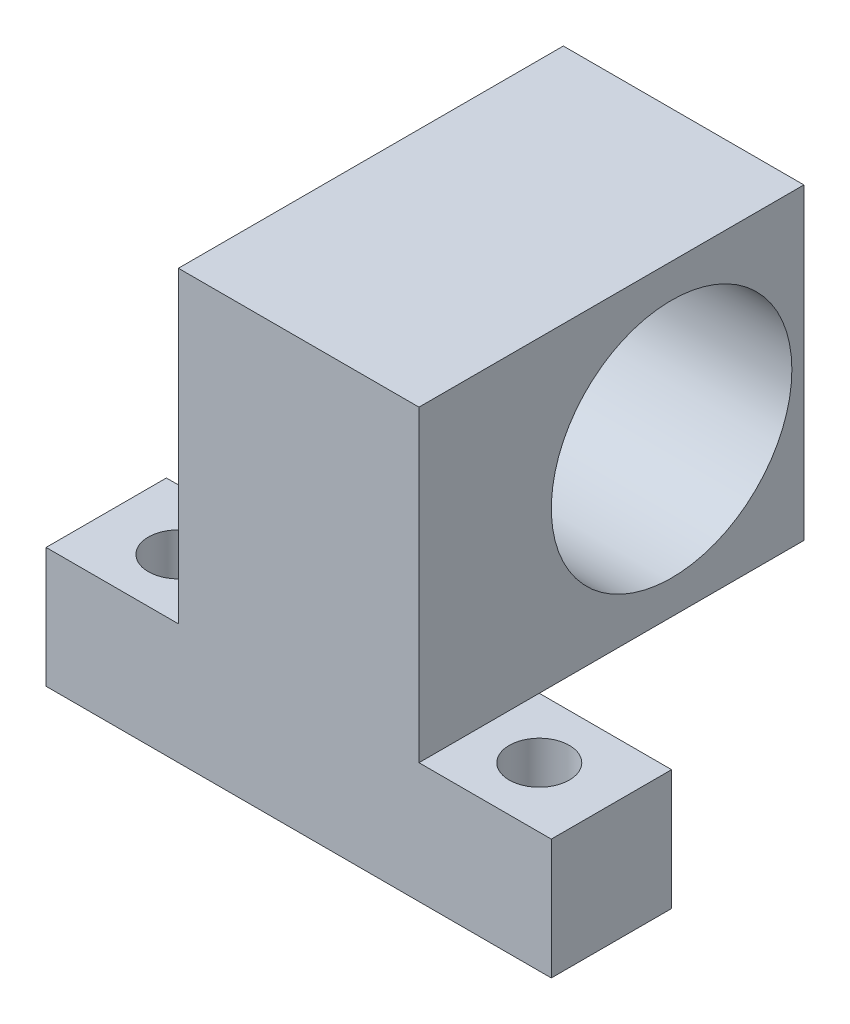
ISO-10303-21;
HEADER;
FILE_DESCRIPTION(('STEP AP214'),'2;1');
FILE_NAME('part.step','',(''),(''),'','','');
FILE_SCHEMA(('AUTOMOTIVE_DESIGN { 1 0 10303 214 1 1 1 1 }'));
ENDSEC;
DATA;
#1=APPLICATION_CONTEXT('core data for automotive mechanical design processes');
#2=APPLICATION_PROTOCOL_DEFINITION('international standard','automotive_design',2000,#1);
#3=PRODUCT_CONTEXT('',#1,'mechanical');
#4=PRODUCT('Part','Part','',(#3));
#5=PRODUCT_RELATED_PRODUCT_CATEGORY('part','',(#4));
#6=PRODUCT_DEFINITION_FORMATION('','',#4);
#7=PRODUCT_DEFINITION_CONTEXT('part definition',#1,'design');
#8=PRODUCT_DEFINITION('design','',#6,#7);
#9=PRODUCT_DEFINITION_SHAPE('','',#8);
#10=(LENGTH_UNIT() NAMED_UNIT(*) SI_UNIT(.MILLI.,.METRE.));
#11=(NAMED_UNIT(*) PLANE_ANGLE_UNIT() SI_UNIT($,.RADIAN.));
#12=(NAMED_UNIT(*) SI_UNIT($,.STERADIAN.) SOLID_ANGLE_UNIT());
#13=UNCERTAINTY_MEASURE_WITH_UNIT(LENGTH_MEASURE(1.E-05),#10,'distance_accuracy_value','');
#14=(GEOMETRIC_REPRESENTATION_CONTEXT(3) GLOBAL_UNCERTAINTY_ASSIGNED_CONTEXT((#13)) GLOBAL_UNIT_ASSIGNED_CONTEXT((#10,
#11,#12)) REPRESENTATION_CONTEXT('',''));
#15=CARTESIAN_POINT('',(0.,0.,0.));
#16=DIRECTION('',(0.,0.,1.));
#17=DIRECTION('',(1.,0.,0.));
#18=AXIS2_PLACEMENT_3D('',#15,#16,#17);
#19=CARTESIAN_POINT('',(0.,5.,5.));
#20=DIRECTION('',(0.,-1.,0.));
#21=DIRECTION('',(0.,0.,-1.));
#22=AXIS2_PLACEMENT_3D('',#19,#20,#21);
#23=PLANE('',#22);
#24=CARTESIAN_POINT('',(3.,5.,2.5));
#25=DIRECTION('',(0.,1.,0.));
#26=DIRECTION('',(0.,0.,1.));
#27=AXIS2_PLACEMENT_3D('',#24,#25,#26);
#28=CIRCLE('',#27,1.25);
#29=CARTESIAN_POINT('',(3.,5.,3.75));
#30=VERTEX_POINT('',#29);
#31=EDGE_CURVE('E171',#30,#30,#28,.T.);
#32=ORIENTED_EDGE('',*,*,#31,.F.);
#33=EDGE_LOOP('',(#32));
#34=FACE_BOUND('',#33,.T.);
#35=DIRECTION('',(0.,0.,1.));
#36=VECTOR('',#35,1.);
#37=CARTESIAN_POINT('',(5.5,5.,5.));
#38=LINE('',#37,#36);
#39=CARTESIAN_POINT('',(5.49999999999999,5.,0.));
#40=VERTEX_POINT('',#39);
#41=CARTESIAN_POINT('',(5.49999999999999,5.,5.));
#42=VERTEX_POINT('',#41);
#43=EDGE_CURVE('E11',#40,#42,#38,.T.);
#44=ORIENTED_EDGE('',*,*,#43,.F.);
#45=DIRECTION('',(-1.,0.,0.));
#46=VECTOR('',#45,1.);
#47=CARTESIAN_POINT('',(0.,5.,0.));
#48=LINE('',#47,#46);
#49=CARTESIAN_POINT('',(0.,5.,0.));
#50=VERTEX_POINT('',#49);
#51=EDGE_CURVE('E157',#40,#50,#48,.T.);
#52=ORIENTED_EDGE('',*,*,#51,.T.);
#53=DIRECTION('',(0.,0.,-1.));
#54=VECTOR('',#53,1.);
#55=CARTESIAN_POINT('',(0.,5.,5.));
#56=LINE('',#55,#54);
#57=CARTESIAN_POINT('',(0.,5.,5.));
#58=VERTEX_POINT('',#57);
#59=EDGE_CURVE('E152',#58,#50,#56,.T.);
#60=ORIENTED_EDGE('',*,*,#59,.F.);
#61=DIRECTION('',(-1.,0.,0.));
#62=VECTOR('',#61,1.);
#63=CARTESIAN_POINT('',(0.,5.,5.));
#64=LINE('',#63,#62);
#65=EDGE_CURVE('E55',#42,#58,#64,.T.);
#66=ORIENTED_EDGE('',*,*,#65,.F.);
#67=EDGE_LOOP('',(#44,#52,#60,#66));
#68=FACE_BOUND('',#67,.T.);
#69=ADVANCED_FACE('F37',(#34,#68),#23,.F.);
#70=CARTESIAN_POINT('',(18.,5.,2.5));
#71=DIRECTION('',(0.,1.,0.));
#72=DIRECTION('',(0.,0.,-1.));
#73=AXIS2_PLACEMENT_3D('',#70,#71,#72);
#74=CIRCLE('',#73,1.25);
#75=CARTESIAN_POINT('',(18.,5.,3.75));
#76=VERTEX_POINT('',#75);
#77=EDGE_CURVE('E176',#76,#76,#74,.T.);
#78=ORIENTED_EDGE('',*,*,#77,.F.);
#79=EDGE_LOOP('',(#78));
#80=FACE_BOUND('',#79,.T.);
#81=DIRECTION('',(0.,0.,-1.));
#82=VECTOR('',#81,1.);
#83=CARTESIAN_POINT('',(15.5,5.,5.));
#84=LINE('',#83,#82);
#85=CARTESIAN_POINT('',(15.5,5.,5.));
#86=VERTEX_POINT('',#85);
#87=CARTESIAN_POINT('',(15.5,5.,0.));
#88=VERTEX_POINT('',#87);
#89=EDGE_CURVE('E62',#86,#88,#84,.T.);
#90=ORIENTED_EDGE('',*,*,#89,.F.);
#91=CARTESIAN_POINT('',(21.,5.,5.));
#92=VERTEX_POINT('',#91);
#93=EDGE_CURVE('E151',#92,#86,#64,.T.);
#94=ORIENTED_EDGE('',*,*,#93,.F.);
#95=DIRECTION('',(0.,0.,-1.));
#96=VECTOR('',#95,1.);
#97=CARTESIAN_POINT('',(21.,5.,5.));
#98=LINE('',#97,#96);
#99=CARTESIAN_POINT('',(21.,5.,0.));
#100=VERTEX_POINT('',#99);
#101=EDGE_CURVE('E162',#92,#100,#98,.T.);
#102=ORIENTED_EDGE('',*,*,#101,.T.);
#103=EDGE_CURVE('E147',#100,#88,#48,.T.);
#104=ORIENTED_EDGE('',*,*,#103,.T.);
#105=EDGE_LOOP('',(#90,#94,#102,#104));
#106=FACE_BOUND('',#105,.T.);
#107=ADVANCED_FACE('F220',(#80,#106),#23,.F.);
#108=CARTESIAN_POINT('',(0.,0.,5.));
#109=DIRECTION('',(1.,0.,0.));
#110=DIRECTION('',(0.,0.,-1.));
#111=AXIS2_PLACEMENT_3D('',#108,#109,#110);
#112=PLANE('',#111);
#113=DIRECTION('',(0.,-1.,0.));
#114=VECTOR('',#113,1.);
#115=CARTESIAN_POINT('',(0.,0.,0.));
#116=LINE('',#115,#114);
#117=CARTESIAN_POINT('',(0.,0.,0.));
#118=VERTEX_POINT('',#117);
#119=EDGE_CURVE('E135',#50,#118,#116,.T.);
#120=ORIENTED_EDGE('',*,*,#119,.T.);
#121=DIRECTION('',(0.,0.,-1.));
#122=VECTOR('',#121,1.);
#123=CARTESIAN_POINT('',(0.,0.,5.));
#124=LINE('',#123,#122);
#125=CARTESIAN_POINT('',(0.,0.,5.));
#126=VERTEX_POINT('',#125);
#127=EDGE_CURVE('E46',#126,#118,#124,.T.);
#128=ORIENTED_EDGE('',*,*,#127,.F.);
#129=DIRECTION('',(0.,-1.,0.));
#130=VECTOR('',#129,1.);
#131=CARTESIAN_POINT('',(0.,0.,5.));
#132=LINE('',#131,#130);
#133=EDGE_CURVE('E144',#58,#126,#132,.T.);
#134=ORIENTED_EDGE('',*,*,#133,.F.);
#135=ORIENTED_EDGE('',*,*,#59,.T.);
#136=EDGE_LOOP('',(#120,#128,#134,#135));
#137=FACE_BOUND('',#136,.T.);
#138=ADVANCED_FACE('F39',(#137),#112,.F.);
#139=CARTESIAN_POINT('',(0.,0.,5.));
#140=DIRECTION('',(0.,1.,0.));
#141=DIRECTION('',(0.,0.,1.));
#142=AXIS2_PLACEMENT_3D('',#139,#140,#141);
#143=PLANE('',#142);
#144=CARTESIAN_POINT('',(3.,0.,2.5));
#145=DIRECTION('',(0.,1.,0.));
#146=DIRECTION('',(0.,0.,1.));
#147=AXIS2_PLACEMENT_3D('',#144,#145,#146);
#148=CIRCLE('',#147,1.25);
#149=CARTESIAN_POINT('',(3.,0.,3.75));
#150=VERTEX_POINT('',#149);
#151=EDGE_CURVE('E41',#150,#150,#148,.T.);
#152=ORIENTED_EDGE('',*,*,#151,.T.);
#153=EDGE_LOOP('',(#152));
#154=FACE_BOUND('',#153,.T.);
#155=CARTESIAN_POINT('',(18.,0.,2.5));
#156=DIRECTION('',(0.,1.,0.));
#157=DIRECTION('',(0.,0.,1.));
#158=AXIS2_PLACEMENT_3D('',#155,#156,#157);
#159=CIRCLE('',#158,1.25);
#160=CARTESIAN_POINT('',(18.,0.,3.75));
#161=VERTEX_POINT('',#160);
#162=EDGE_CURVE('E169',#161,#161,#159,.T.);
#163=ORIENTED_EDGE('',*,*,#162,.T.);
#164=EDGE_LOOP('',(#163));
#165=FACE_BOUND('',#164,.T.);
#166=DIRECTION('',(1.,0.,0.));
#167=VECTOR('',#166,1.);
#168=CARTESIAN_POINT('',(0.,0.,0.));
#169=LINE('',#168,#167);
#170=CARTESIAN_POINT('',(21.,0.,0.));
#171=VERTEX_POINT('',#170);
#172=EDGE_CURVE('E138',#118,#171,#169,.T.);
#173=ORIENTED_EDGE('',*,*,#172,.T.);
#174=DIRECTION('',(0.,0.,-1.));
#175=VECTOR('',#174,1.);
#176=CARTESIAN_POINT('',(21.,0.,5.));
#177=LINE('',#176,#175);
#178=CARTESIAN_POINT('',(21.,0.,5.));
#179=VERTEX_POINT('',#178);
#180=EDGE_CURVE('E165',#179,#171,#177,.T.);
#181=ORIENTED_EDGE('',*,*,#180,.F.);
#182=DIRECTION('',(1.,0.,0.));
#183=VECTOR('',#182,1.);
#184=CARTESIAN_POINT('',(0.,0.,5.));
#185=LINE('',#184,#183);
#186=EDGE_CURVE('E146',#126,#179,#185,.T.);
#187=ORIENTED_EDGE('',*,*,#186,.F.);
#188=ORIENTED_EDGE('',*,*,#127,.T.);
#189=EDGE_LOOP('',(#173,#181,#187,#188));
#190=FACE_BOUND('',#189,.T.);
#191=ADVANCED_FACE('F215',(#154,#165,#190),#143,.F.);
#192=CARTESIAN_POINT('',(21.,0.,5.));
#193=DIRECTION('',(-1.,0.,0.));
#194=DIRECTION('',(0.,0.,1.));
#195=AXIS2_PLACEMENT_3D('',#192,#193,#194);
#196=PLANE('',#195);
#197=DIRECTION('',(0.,1.,0.));
#198=VECTOR('',#197,1.);
#199=CARTESIAN_POINT('',(21.,0.,0.));
#200=LINE('',#199,#198);
#201=EDGE_CURVE('E155',#171,#100,#200,.T.);
#202=ORIENTED_EDGE('',*,*,#201,.T.);
#203=ORIENTED_EDGE('',*,*,#101,.F.);
#204=DIRECTION('',(0.,1.,0.));
#205=VECTOR('',#204,1.);
#206=CARTESIAN_POINT('',(21.,0.,5.));
#207=LINE('',#206,#205);
#208=EDGE_CURVE('E149',#179,#92,#207,.T.);
#209=ORIENTED_EDGE('',*,*,#208,.F.);
#210=ORIENTED_EDGE('',*,*,#180,.T.);
#211=EDGE_LOOP('',(#202,#203,#209,#210));
#212=FACE_BOUND('',#211,.T.);
#213=ADVANCED_FACE('F219',(#212),#196,.F.);
#214=CARTESIAN_POINT('',(0.,0.,5.));
#215=DIRECTION('',(0.,0.,-1.));
#216=DIRECTION('',(-1.,0.,0.));
#217=AXIS2_PLACEMENT_3D('',#214,#215,#216);
#218=PLANE('',#217);
#219=ORIENTED_EDGE('',*,*,#133,.T.);
#220=ORIENTED_EDGE('',*,*,#186,.T.);
#221=ORIENTED_EDGE('',*,*,#208,.T.);
#222=ORIENTED_EDGE('',*,*,#93,.T.);
#223=DIRECTION('',(0.,-1.,0.));
#224=VECTOR('',#223,1.);
#225=CARTESIAN_POINT('',(15.5,17.8,5.));
#226=LINE('',#225,#224);
#227=CARTESIAN_POINT('',(15.5,17.8,5.));
#228=VERTEX_POINT('',#227);
#229=EDGE_CURVE('E118',#228,#86,#226,.T.);
#230=ORIENTED_EDGE('',*,*,#229,.F.);
#231=DIRECTION('',(1.,0.,0.));
#232=VECTOR('',#231,1.);
#233=CARTESIAN_POINT('',(5.5,17.8,5.));
#234=LINE('',#233,#232);
#235=CARTESIAN_POINT('',(5.5,17.8,5.));
#236=VERTEX_POINT('',#235);
#237=EDGE_CURVE('E111',#236,#228,#234,.T.);
#238=ORIENTED_EDGE('',*,*,#237,.F.);
#239=DIRECTION('',(0.,-1.,0.));
#240=VECTOR('',#239,1.);
#241=CARTESIAN_POINT('',(5.5,17.8,5.));
#242=LINE('',#241,#240);
#243=EDGE_CURVE('E116',#236,#42,#242,.T.);
#244=ORIENTED_EDGE('',*,*,#243,.T.);
#245=ORIENTED_EDGE('',*,*,#65,.T.);
#246=EDGE_LOOP('',(#219,#220,#221,#222,#230,#238,#244,#245));
#247=FACE_BOUND('',#246,.T.);
#248=ADVANCED_FACE('F114',(#247),#218,.F.);
#249=CARTESIAN_POINT('',(0.,0.,0.));
#250=DIRECTION('',(0.,0.,-1.));
#251=DIRECTION('',(-1.,0.,0.));
#252=AXIS2_PLACEMENT_3D('',#249,#250,#251);
#253=PLANE('',#252);
#254=ORIENTED_EDGE('',*,*,#119,.F.);
#255=ORIENTED_EDGE('',*,*,#51,.F.);
#256=EDGE_CURVE('E159',#88,#40,#48,.T.);
#257=ORIENTED_EDGE('',*,*,#256,.F.);
#258=ORIENTED_EDGE('',*,*,#103,.F.);
#259=ORIENTED_EDGE('',*,*,#201,.F.);
#260=ORIENTED_EDGE('',*,*,#172,.F.);
#261=EDGE_LOOP('',(#254,#255,#257,#258,#259,#260));
#262=FACE_BOUND('',#261,.T.);
#263=ADVANCED_FACE('F211',(#262),#253,.T.);
#264=CARTESIAN_POINT('',(5.5,17.8,5.));
#265=DIRECTION('',(1.,0.,0.));
#266=DIRECTION('',(0.,0.,-1.));
#267=AXIS2_PLACEMENT_3D('',#264,#265,#266);
#268=PLANE('',#267);
#269=CARTESIAN_POINT('',(5.5,11.4,-5.5));
#270=DIRECTION('',(1.,0.,0.));
#271=DIRECTION('',(0.,0.,-1.));
#272=AXIS2_PLACEMENT_3D('',#269,#270,#271);
#273=CIRCLE('',#272,5.);
#274=CARTESIAN_POINT('',(5.5,11.4,-10.5));
#275=VERTEX_POINT('',#274);
#276=EDGE_CURVE('E181',#275,#275,#273,.T.);
#277=ORIENTED_EDGE('',*,*,#276,.T.);
#278=EDGE_LOOP('',(#277));
#279=FACE_BOUND('',#278,.T.);
#280=CARTESIAN_POINT('',(5.5,5.,-11.));
#281=VERTEX_POINT('',#280);
#282=EDGE_CURVE('E48',#281,#40,#38,.T.);
#283=ORIENTED_EDGE('',*,*,#282,.T.);
#284=ORIENTED_EDGE('',*,*,#43,.T.);
#285=ORIENTED_EDGE('',*,*,#243,.F.);
#286=DIRECTION('',(0.,0.,1.));
#287=VECTOR('',#286,1.);
#288=CARTESIAN_POINT('',(5.5,17.8,5.));
#289=LINE('',#288,#287);
#290=CARTESIAN_POINT('',(5.5,17.8,-11.));
#291=VERTEX_POINT('',#290);
#292=EDGE_CURVE('E122',#291,#236,#289,.T.);
#293=ORIENTED_EDGE('',*,*,#292,.F.);
#294=DIRECTION('',(0.,-1.,0.));
#295=VECTOR('',#294,1.);
#296=CARTESIAN_POINT('',(5.5,17.8,-11.));
#297=LINE('',#296,#295);
#298=EDGE_CURVE('E187',#291,#281,#297,.T.);
#299=ORIENTED_EDGE('',*,*,#298,.T.);
#300=EDGE_LOOP('',(#283,#284,#285,#293,#299));
#301=FACE_BOUND('',#300,.T.);
#302=ADVANCED_FACE('F134',(#279,#301),#268,.F.);
#303=CARTESIAN_POINT('',(15.5,17.8,5.));
#304=DIRECTION('',(-1.,0.,0.));
#305=DIRECTION('',(0.,0.,1.));
#306=AXIS2_PLACEMENT_3D('',#303,#304,#305);
#307=PLANE('',#306);
#308=CARTESIAN_POINT('',(15.5,11.4,-5.5));
#309=DIRECTION('',(1.,0.,0.));
#310=DIRECTION('',(0.,0.,-1.));
#311=AXIS2_PLACEMENT_3D('',#308,#309,#310);
#312=CIRCLE('',#311,5.);
#313=CARTESIAN_POINT('',(15.5,11.4,-10.5));
#314=VERTEX_POINT('',#313);
#315=EDGE_CURVE('E358',#314,#314,#312,.T.);
#316=ORIENTED_EDGE('',*,*,#315,.F.);
#317=EDGE_LOOP('',(#316));
#318=FACE_BOUND('',#317,.T.);
#319=ORIENTED_EDGE('',*,*,#89,.T.);
#320=CARTESIAN_POINT('',(15.5,5.,-11.));
#321=VERTEX_POINT('',#320);
#322=EDGE_CURVE('E189',#88,#321,#84,.T.);
#323=ORIENTED_EDGE('',*,*,#322,.T.);
#324=DIRECTION('',(0.,-1.,0.));
#325=VECTOR('',#324,1.);
#326=CARTESIAN_POINT('',(15.5,17.8,-11.));
#327=LINE('',#326,#325);
#328=CARTESIAN_POINT('',(15.5,17.8,-11.));
#329=VERTEX_POINT('',#328);
#330=EDGE_CURVE('E140',#329,#321,#327,.T.);
#331=ORIENTED_EDGE('',*,*,#330,.F.);
#332=DIRECTION('',(0.,0.,-1.));
#333=VECTOR('',#332,1.);
#334=CARTESIAN_POINT('',(15.5,17.8,5.));
#335=LINE('',#334,#333);
#336=EDGE_CURVE('E121',#228,#329,#335,.T.);
#337=ORIENTED_EDGE('',*,*,#336,.F.);
#338=ORIENTED_EDGE('',*,*,#229,.T.);
#339=EDGE_LOOP('',(#319,#323,#331,#337,#338));
#340=FACE_BOUND('',#339,.T.);
#341=ADVANCED_FACE('F260',(#318,#340),#307,.F.);
#342=CARTESIAN_POINT('',(5.5,17.8,-11.));
#343=DIRECTION('',(0.,0.,1.));
#344=DIRECTION('',(1.,0.,0.));
#345=AXIS2_PLACEMENT_3D('',#342,#343,#344);
#346=PLANE('',#345);
#347=DIRECTION('',(-1.,0.,0.));
#348=VECTOR('',#347,1.);
#349=CARTESIAN_POINT('',(5.5,5.,-11.));
#350=LINE('',#349,#348);
#351=EDGE_CURVE('E131',#321,#281,#350,.T.);
#352=ORIENTED_EDGE('',*,*,#351,.T.);
#353=ORIENTED_EDGE('',*,*,#298,.F.);
#354=DIRECTION('',(-1.,0.,0.));
#355=VECTOR('',#354,1.);
#356=CARTESIAN_POINT('',(5.5,17.8,-11.));
#357=LINE('',#356,#355);
#358=EDGE_CURVE('E127',#329,#291,#357,.T.);
#359=ORIENTED_EDGE('',*,*,#358,.F.);
#360=ORIENTED_EDGE('',*,*,#330,.T.);
#361=EDGE_LOOP('',(#352,#353,#359,#360));
#362=FACE_BOUND('',#361,.T.);
#363=ADVANCED_FACE('F196',(#362),#346,.F.);
#364=CARTESIAN_POINT('',(0.,17.8,0.));
#365=DIRECTION('',(0.,-1.,0.));
#366=DIRECTION('',(0.,0.,-1.));
#367=AXIS2_PLACEMENT_3D('',#364,#365,#366);
#368=PLANE('',#367);
#369=ORIENTED_EDGE('',*,*,#292,.T.);
#370=ORIENTED_EDGE('',*,*,#237,.T.);
#371=ORIENTED_EDGE('',*,*,#336,.T.);
#372=ORIENTED_EDGE('',*,*,#358,.T.);
#373=EDGE_LOOP('',(#369,#370,#371,#372));
#374=FACE_BOUND('',#373,.T.);
#375=ADVANCED_FACE('F125',(#374),#368,.F.);
#376=CARTESIAN_POINT('',(0.,5.,0.));
#377=DIRECTION('',(0.,-1.,0.));
#378=DIRECTION('',(0.,0.,-1.));
#379=AXIS2_PLACEMENT_3D('',#376,#377,#378);
#380=PLANE('',#379);
#381=ORIENTED_EDGE('',*,*,#322,.F.);
#382=ORIENTED_EDGE('',*,*,#256,.T.);
#383=ORIENTED_EDGE('',*,*,#282,.F.);
#384=ORIENTED_EDGE('',*,*,#351,.F.);
#385=EDGE_LOOP('',(#381,#382,#383,#384));
#386=FACE_BOUND('',#385,.T.);
#387=ADVANCED_FACE('F201',(#386),#380,.T.);
#388=CARTESIAN_POINT('',(18.,-8.,2.5));
#389=DIRECTION('',(0.,1.,0.));
#390=DIRECTION('',(0.,0.,1.));
#391=AXIS2_PLACEMENT_3D('',#388,#389,#390);
#392=CYLINDRICAL_SURFACE('',#391,1.25);
#393=CARTESIAN_POINT('',(18.,5.,3.75));
#394=CARTESIAN_POINT('',(18.,4.94791666666667,3.75));
#395=CARTESIAN_POINT('',(18.,4.89583333333333,3.75));
#396=CARTESIAN_POINT('',(18.,4.79166666666667,3.75));
#397=CARTESIAN_POINT('',(18.,4.73958333333333,3.75));
#398=CARTESIAN_POINT('',(18.,4.63541666666667,3.75));
#399=CARTESIAN_POINT('',(18.,4.58333333333333,3.75));
#400=CARTESIAN_POINT('',(18.,4.47916666666667,3.75));
#401=CARTESIAN_POINT('',(18.,4.42708333333333,3.75));
#402=CARTESIAN_POINT('',(18.,4.32291666666667,3.75));
#403=CARTESIAN_POINT('',(18.,4.27083333333333,3.75));
#404=CARTESIAN_POINT('',(18.,4.16666666666667,3.75));
#405=CARTESIAN_POINT('',(18.,4.11458333333333,3.75));
#406=CARTESIAN_POINT('',(18.,4.01041666666666,3.75));
#407=CARTESIAN_POINT('',(18.,3.95833333333333,3.75));
#408=CARTESIAN_POINT('',(18.,3.85416666666667,3.75));
#409=CARTESIAN_POINT('',(18.,3.80208333333333,3.75));
#410=CARTESIAN_POINT('',(18.,3.69791666666666,3.75));
#411=CARTESIAN_POINT('',(18.,3.64583333333333,3.75));
#412=CARTESIAN_POINT('',(18.,3.54166666666667,3.75));
#413=CARTESIAN_POINT('',(18.,3.48958333333333,3.75));
#414=CARTESIAN_POINT('',(18.,3.38541666666667,3.75));
#415=CARTESIAN_POINT('',(18.,3.33333333333333,3.75));
#416=CARTESIAN_POINT('',(18.,3.22916666666667,3.75));
#417=CARTESIAN_POINT('',(18.,3.17708333333333,3.75));
#418=CARTESIAN_POINT('',(18.,3.07291666666667,3.75));
#419=CARTESIAN_POINT('',(18.,3.02083333333333,3.75));
#420=CARTESIAN_POINT('',(18.,2.91666666666667,3.75));
#421=CARTESIAN_POINT('',(18.,2.86458333333333,3.75));
#422=CARTESIAN_POINT('',(18.,2.76041666666667,3.75));
#423=CARTESIAN_POINT('',(18.,2.70833333333333,3.75));
#424=CARTESIAN_POINT('',(18.,2.60416666666667,3.75));
#425=CARTESIAN_POINT('',(18.,2.55208333333333,3.75));
#426=CARTESIAN_POINT('',(18.,2.44791666666667,3.75));
#427=CARTESIAN_POINT('',(18.,2.39583333333333,3.75));
#428=CARTESIAN_POINT('',(18.,2.29166666666667,3.75));
#429=CARTESIAN_POINT('',(18.,2.23958333333333,3.75));
#430=CARTESIAN_POINT('',(18.,2.13541666666667,3.75));
#431=CARTESIAN_POINT('',(18.,2.08333333333333,3.75));
#432=CARTESIAN_POINT('',(18.,1.97916666666667,3.75));
#433=CARTESIAN_POINT('',(18.,1.92708333333333,3.75));
#434=CARTESIAN_POINT('',(18.,1.82291666666666,3.75));
#435=CARTESIAN_POINT('',(18.,1.77083333333333,3.75));
#436=CARTESIAN_POINT('',(18.,1.66666666666667,3.75));
#437=CARTESIAN_POINT('',(18.,1.61458333333333,3.75));
#438=CARTESIAN_POINT('',(18.,1.51041666666667,3.75));
#439=CARTESIAN_POINT('',(18.,1.45833333333333,3.75));
#440=CARTESIAN_POINT('',(18.,1.35416666666667,3.75));
#441=CARTESIAN_POINT('',(18.,1.30208333333333,3.75));
#442=CARTESIAN_POINT('',(18.,1.19791666666667,3.75));
#443=CARTESIAN_POINT('',(18.,1.14583333333333,3.75));
#444=CARTESIAN_POINT('',(18.,1.04166666666667,3.75));
#445=CARTESIAN_POINT('',(18.,0.989583333333333,3.75));
#446=CARTESIAN_POINT('',(18.,0.885416666666666,3.75));
#447=CARTESIAN_POINT('',(18.,0.833333333333332,3.75));
#448=CARTESIAN_POINT('',(18.,0.729166666666666,3.75));
#449=CARTESIAN_POINT('',(18.,0.677083333333332,3.75));
#450=CARTESIAN_POINT('',(18.,0.572916666666666,3.75));
#451=CARTESIAN_POINT('',(18.,0.520833333333332,3.75));
#452=CARTESIAN_POINT('',(18.,0.416666666666665,3.75));
#453=CARTESIAN_POINT('',(18.,0.364583333333332,3.75));
#454=CARTESIAN_POINT('',(18.,0.260416666666665,3.75));
#455=CARTESIAN_POINT('',(18.,0.208333333333332,3.75));
#456=CARTESIAN_POINT('',(18.,0.104166666666665,3.75));
#457=CARTESIAN_POINT('',(18.,0.0520833333333317,3.75));
#458=CARTESIAN_POINT('',(18.,0.,3.75));
#459=B_SPLINE_CURVE_WITH_KNOTS('',3,(#393,#394,#395,#396,#397,#398,#399,#400,#401,#402,#403,
#404,#405,#406,#407,#408,#409,#410,#411,#412,#413,#414,#415,#416,#417,#418,#419,#420,#421,#422,
#423,#424,#425,#426,#427,#428,#429,#430,#431,#432,#433,#434,#435,#436,#437,#438,#439,#440,#441,
#442,#443,#444,#445,#446,#447,#448,#449,#450,#451,#452,#453,#454,#455,#456,#457,#458),
.UNSPECIFIED.,.F.,.F.,(4,2,2,2,2,2,2,2,2,2,2,2,2,2,2,2,2,2,2,2,2,2,2,2,2,2,2,2,2,2,2,2,4),(0.,
0.15625,0.3125,0.46875,0.625000000000001,0.781250000000001,0.937500000000001,1.09375,1.25,
1.40625,1.5625,1.71875,1.875,2.03125,2.1875,2.34375,2.5,2.65625,2.8125,2.96875,3.125,3.28125,
3.4375,3.59375,3.75,3.90625,4.0625,4.21875,4.375,4.53125,4.6875,4.84375,5.),.UNSPECIFIED.);
#460=EDGE_CURVE('BSEAM243',#76,#161,#459,.T.);
#461=ORIENTED_EDGE('',*,*,#77,.T.);
#462=ORIENTED_EDGE('',*,*,#162,.F.);
#463=ORIENTED_EDGE('',*,*,#460,.T.);
#464=ORIENTED_EDGE('',*,*,#460,.F.);
#465=EDGE_LOOP('',(#461,#463,#462,#464));
#466=FACE_BOUND('',#465,.T.);
#467=ADVANCED_FACE('F243',(#466),#392,.F.);
#468=CARTESIAN_POINT('',(3.,-8.,2.5));
#469=DIRECTION('',(0.,1.,0.));
#470=DIRECTION('',(0.,0.,1.));
#471=AXIS2_PLACEMENT_3D('',#468,#469,#470);
#472=CYLINDRICAL_SURFACE('',#471,1.25);
#473=CARTESIAN_POINT('',(3.,5.,3.75));
#474=CARTESIAN_POINT('',(3.,4.94791666666667,3.75));
#475=CARTESIAN_POINT('',(3.,4.89583333333333,3.75));
#476=CARTESIAN_POINT('',(3.,4.79166666666667,3.75));
#477=CARTESIAN_POINT('',(3.,4.73958333333333,3.75));
#478=CARTESIAN_POINT('',(3.,4.63541666666667,3.75));
#479=CARTESIAN_POINT('',(3.,4.58333333333333,3.75));
#480=CARTESIAN_POINT('',(3.,4.47916666666667,3.75));
#481=CARTESIAN_POINT('',(3.,4.42708333333333,3.75));
#482=CARTESIAN_POINT('',(3.,4.32291666666667,3.75));
#483=CARTESIAN_POINT('',(3.,4.27083333333333,3.75));
#484=CARTESIAN_POINT('',(3.,4.16666666666667,3.75));
#485=CARTESIAN_POINT('',(3.,4.11458333333333,3.75));
#486=CARTESIAN_POINT('',(3.,4.01041666666666,3.75));
#487=CARTESIAN_POINT('',(3.,3.95833333333333,3.75));
#488=CARTESIAN_POINT('',(3.,3.85416666666667,3.75));
#489=CARTESIAN_POINT('',(3.,3.80208333333333,3.75));
#490=CARTESIAN_POINT('',(3.,3.69791666666666,3.75));
#491=CARTESIAN_POINT('',(3.,3.64583333333333,3.75));
#492=CARTESIAN_POINT('',(3.,3.54166666666667,3.75));
#493=CARTESIAN_POINT('',(3.,3.48958333333333,3.75));
#494=CARTESIAN_POINT('',(3.,3.38541666666667,3.75));
#495=CARTESIAN_POINT('',(3.,3.33333333333333,3.75));
#496=CARTESIAN_POINT('',(3.,3.22916666666667,3.75));
#497=CARTESIAN_POINT('',(3.,3.17708333333333,3.75));
#498=CARTESIAN_POINT('',(3.,3.07291666666667,3.75));
#499=CARTESIAN_POINT('',(3.,3.02083333333333,3.75));
#500=CARTESIAN_POINT('',(3.,2.91666666666667,3.75));
#501=CARTESIAN_POINT('',(3.,2.86458333333333,3.75));
#502=CARTESIAN_POINT('',(3.,2.76041666666667,3.75));
#503=CARTESIAN_POINT('',(3.,2.70833333333333,3.75));
#504=CARTESIAN_POINT('',(3.,2.60416666666667,3.75));
#505=CARTESIAN_POINT('',(3.,2.55208333333333,3.75));
#506=CARTESIAN_POINT('',(3.,2.44791666666667,3.75));
#507=CARTESIAN_POINT('',(3.,2.39583333333333,3.75));
#508=CARTESIAN_POINT('',(3.,2.29166666666667,3.75));
#509=CARTESIAN_POINT('',(3.,2.23958333333333,3.75));
#510=CARTESIAN_POINT('',(3.,2.13541666666667,3.75));
#511=CARTESIAN_POINT('',(3.,2.08333333333333,3.75));
#512=CARTESIAN_POINT('',(3.,1.97916666666667,3.75));
#513=CARTESIAN_POINT('',(3.,1.92708333333333,3.75));
#514=CARTESIAN_POINT('',(3.,1.82291666666666,3.75));
#515=CARTESIAN_POINT('',(3.,1.77083333333333,3.75));
#516=CARTESIAN_POINT('',(3.,1.66666666666667,3.75));
#517=CARTESIAN_POINT('',(3.,1.61458333333333,3.75));
#518=CARTESIAN_POINT('',(3.,1.51041666666667,3.75));
#519=CARTESIAN_POINT('',(3.,1.45833333333333,3.75));
#520=CARTESIAN_POINT('',(3.,1.35416666666667,3.75));
#521=CARTESIAN_POINT('',(3.,1.30208333333333,3.75));
#522=CARTESIAN_POINT('',(3.,1.19791666666667,3.75));
#523=CARTESIAN_POINT('',(3.,1.14583333333333,3.75));
#524=CARTESIAN_POINT('',(3.,1.04166666666667,3.75));
#525=CARTESIAN_POINT('',(3.,0.989583333333333,3.75));
#526=CARTESIAN_POINT('',(3.,0.885416666666666,3.75));
#527=CARTESIAN_POINT('',(3.,0.833333333333332,3.75));
#528=CARTESIAN_POINT('',(3.,0.729166666666666,3.75));
#529=CARTESIAN_POINT('',(3.,0.677083333333332,3.75));
#530=CARTESIAN_POINT('',(3.,0.572916666666666,3.75));
#531=CARTESIAN_POINT('',(3.,0.520833333333332,3.75));
#532=CARTESIAN_POINT('',(3.,0.416666666666665,3.75));
#533=CARTESIAN_POINT('',(3.,0.364583333333332,3.75));
#534=CARTESIAN_POINT('',(3.,0.260416666666665,3.75));
#535=CARTESIAN_POINT('',(3.,0.208333333333332,3.75));
#536=CARTESIAN_POINT('',(3.,0.104166666666665,3.75));
#537=CARTESIAN_POINT('',(3.,0.0520833333333317,3.75));
#538=CARTESIAN_POINT('',(3.,0.,3.75));
#539=B_SPLINE_CURVE_WITH_KNOTS('',3,(#473,#474,#475,#476,#477,#478,#479,#480,#481,#482,#483,
#484,#485,#486,#487,#488,#489,#490,#491,#492,#493,#494,#495,#496,#497,#498,#499,#500,#501,#502,
#503,#504,#505,#506,#507,#508,#509,#510,#511,#512,#513,#514,#515,#516,#517,#518,#519,#520,#521,
#522,#523,#524,#525,#526,#527,#528,#529,#530,#531,#532,#533,#534,#535,#536,#537,#538),
.UNSPECIFIED.,.F.,.F.,(4,2,2,2,2,2,2,2,2,2,2,2,2,2,2,2,2,2,2,2,2,2,2,2,2,2,2,2,2,2,2,2,4),(0.,
0.15625,0.3125,0.46875,0.625000000000001,0.781250000000001,0.937500000000001,1.09375,1.25,
1.40625,1.5625,1.71875,1.875,2.03125,2.1875,2.34375,2.5,2.65625,2.8125,2.96875,3.125,3.28125,
3.4375,3.59375,3.75,3.90625,4.0625,4.21875,4.375,4.53125,4.6875,4.84375,5.),.UNSPECIFIED.);
#540=EDGE_CURVE('BSEAM240',#30,#150,#539,.T.);
#541=ORIENTED_EDGE('',*,*,#31,.T.);
#542=ORIENTED_EDGE('',*,*,#151,.F.);
#543=ORIENTED_EDGE('',*,*,#540,.T.);
#544=ORIENTED_EDGE('',*,*,#540,.F.);
#545=EDGE_LOOP('',(#541,#543,#542,#544));
#546=FACE_BOUND('',#545,.T.);
#547=ADVANCED_FACE('F240',(#546),#472,.F.);
#548=CARTESIAN_POINT('',(2.5,11.4,-5.5));
#549=DIRECTION('',(1.,0.,0.));
#550=DIRECTION('',(0.,0.,-1.));
#551=AXIS2_PLACEMENT_3D('',#548,#549,#550);
#552=CYLINDRICAL_SURFACE('',#551,5.);
#553=CARTESIAN_POINT('',(15.5,11.4,-10.5));
#554=CARTESIAN_POINT('',(15.3958333333333,11.4,-10.5));
#555=CARTESIAN_POINT('',(15.2916666666667,11.4,-10.5));
#556=CARTESIAN_POINT('',(15.0833333333333,11.4,-10.5));
#557=CARTESIAN_POINT('',(14.9791666666667,11.4,-10.5));
#558=CARTESIAN_POINT('',(14.7708333333333,11.4,-10.5));
#559=CARTESIAN_POINT('',(14.6666666666667,11.4,-10.5));
#560=CARTESIAN_POINT('',(14.4583333333333,11.4,-10.5));
#561=CARTESIAN_POINT('',(14.3541666666667,11.4,-10.5));
#562=CARTESIAN_POINT('',(14.1458333333333,11.4,-10.5));
#563=CARTESIAN_POINT('',(14.0416666666667,11.4,-10.5));
#564=CARTESIAN_POINT('',(13.8333333333333,11.4,-10.5));
#565=CARTESIAN_POINT('',(13.7291666666667,11.4,-10.5));
#566=CARTESIAN_POINT('',(13.5208333333333,11.4,-10.5));
#567=CARTESIAN_POINT('',(13.4166666666667,11.4,-10.5));
#568=CARTESIAN_POINT('',(13.2083333333333,11.4,-10.5));
#569=CARTESIAN_POINT('',(13.1041666666667,11.4,-10.5));
#570=CARTESIAN_POINT('',(12.8958333333333,11.4,-10.5));
#571=CARTESIAN_POINT('',(12.7916666666667,11.4,-10.5));
#572=CARTESIAN_POINT('',(12.5833333333333,11.4,-10.5));
#573=CARTESIAN_POINT('',(12.4791666666667,11.4,-10.5));
#574=CARTESIAN_POINT('',(12.2708333333333,11.4,-10.5));
#575=CARTESIAN_POINT('',(12.1666666666667,11.4,-10.5));
#576=CARTESIAN_POINT('',(11.9583333333333,11.4,-10.5));
#577=CARTESIAN_POINT('',(11.8541666666667,11.4,-10.5));
#578=CARTESIAN_POINT('',(11.6458333333333,11.4,-10.5));
#579=CARTESIAN_POINT('',(11.5416666666667,11.4,-10.5));
#580=CARTESIAN_POINT('',(11.3333333333333,11.4,-10.5));
#581=CARTESIAN_POINT('',(11.2291666666667,11.4,-10.5));
#582=CARTESIAN_POINT('',(11.0208333333333,11.4,-10.5));
#583=CARTESIAN_POINT('',(10.9166666666667,11.4,-10.5));
#584=CARTESIAN_POINT('',(10.7083333333333,11.4,-10.5));
#585=CARTESIAN_POINT('',(10.6041666666667,11.4,-10.5));
#586=CARTESIAN_POINT('',(10.3958333333333,11.4,-10.5));
#587=CARTESIAN_POINT('',(10.2916666666667,11.4,-10.5));
#588=CARTESIAN_POINT('',(10.0833333333333,11.4,-10.5));
#589=CARTESIAN_POINT('',(9.97916666666666,11.4,-10.5));
#590=CARTESIAN_POINT('',(9.77083333333333,11.4,-10.5));
#591=CARTESIAN_POINT('',(9.66666666666666,11.4,-10.5));
#592=CARTESIAN_POINT('',(9.45833333333333,11.4,-10.5));
#593=CARTESIAN_POINT('',(9.35416666666666,11.4,-10.5));
#594=CARTESIAN_POINT('',(9.14583333333333,11.4,-10.5));
#595=CARTESIAN_POINT('',(9.04166666666666,11.4,-10.5));
#596=CARTESIAN_POINT('',(8.83333333333333,11.4,-10.5));
#597=CARTESIAN_POINT('',(8.72916666666666,11.4,-10.5));
#598=CARTESIAN_POINT('',(8.52083333333333,11.4,-10.5));
#599=CARTESIAN_POINT('',(8.41666666666666,11.4,-10.5));
#600=CARTESIAN_POINT('',(8.20833333333333,11.4,-10.5));
#601=CARTESIAN_POINT('',(8.10416666666666,11.4,-10.5));
#602=CARTESIAN_POINT('',(7.89583333333333,11.4,-10.5));
#603=CARTESIAN_POINT('',(7.79166666666666,11.4,-10.5));
#604=CARTESIAN_POINT('',(7.58333333333333,11.4,-10.5));
#605=CARTESIAN_POINT('',(7.47916666666666,11.4,-10.5));
#606=CARTESIAN_POINT('',(7.27083333333333,11.4,-10.5));
#607=CARTESIAN_POINT('',(7.16666666666666,11.4,-10.5));
#608=CARTESIAN_POINT('',(6.95833333333333,11.4,-10.5));
#609=CARTESIAN_POINT('',(6.85416666666666,11.4,-10.5));
#610=CARTESIAN_POINT('',(6.64583333333333,11.4,-10.5));
#611=CARTESIAN_POINT('',(6.54166666666666,11.4,-10.5));
#612=CARTESIAN_POINT('',(6.33333333333333,11.4,-10.5));
#613=CARTESIAN_POINT('',(6.22916666666666,11.4,-10.5));
#614=CARTESIAN_POINT('',(6.02083333333333,11.4,-10.5));
#615=CARTESIAN_POINT('',(5.91666666666666,11.4,-10.5));
#616=CARTESIAN_POINT('',(5.70833333333333,11.4,-10.5));
#617=CARTESIAN_POINT('',(5.60416666666666,11.4,-10.5));
#618=CARTESIAN_POINT('',(5.5,11.4,-10.5));
#619=B_SPLINE_CURVE_WITH_KNOTS('',3,(#553,#554,#555,#556,#557,#558,#559,#560,#561,#562,#563,
#564,#565,#566,#567,#568,#569,#570,#571,#572,#573,#574,#575,#576,#577,#578,#579,#580,#581,#582,
#583,#584,#585,#586,#587,#588,#589,#590,#591,#592,#593,#594,#595,#596,#597,#598,#599,#600,#601,
#602,#603,#604,#605,#606,#607,#608,#609,#610,#611,#612,#613,#614,#615,#616,#617,#618),
.UNSPECIFIED.,.F.,.F.,(4,2,2,2,2,2,2,2,2,2,2,2,2,2,2,2,2,2,2,2,2,2,2,2,2,2,2,2,2,2,2,2,4),(0.,
0.3125,0.625000000000001,0.937500000000001,1.25,1.5625,1.875,2.1875,2.5,2.8125,3.125,3.4375,
3.75,4.0625,4.375,4.6875,5.,5.3125,5.625,5.9375,6.25,6.5625,6.875,7.1875,7.5,7.8125,8.125,
8.4375,8.75,9.0625,9.375,9.6875,10.),.UNSPECIFIED.);
#620=EDGE_CURVE('BSEAM242',#314,#275,#619,.T.);
#621=ORIENTED_EDGE('',*,*,#315,.T.);
#622=ORIENTED_EDGE('',*,*,#276,.F.);
#623=ORIENTED_EDGE('',*,*,#620,.T.);
#624=ORIENTED_EDGE('',*,*,#620,.F.);
#625=EDGE_LOOP('',(#621,#623,#622,#624));
#626=FACE_BOUND('',#625,.T.);
#627=ADVANCED_FACE('F242',(#626),#552,.F.);
#628=CLOSED_SHELL('',(#69,#107,#138,#191,#213,#248,#263,#302,#341,#363,#375,#387,#467,#547,#627));
#629=MANIFOLD_SOLID_BREP('B2',#628);
#630=ADVANCED_BREP_SHAPE_REPRESENTATION('',(#18,#629),#14);
#631=SHAPE_DEFINITION_REPRESENTATION(#9,#630);
ENDSEC;
END-ISO-10303-21;
